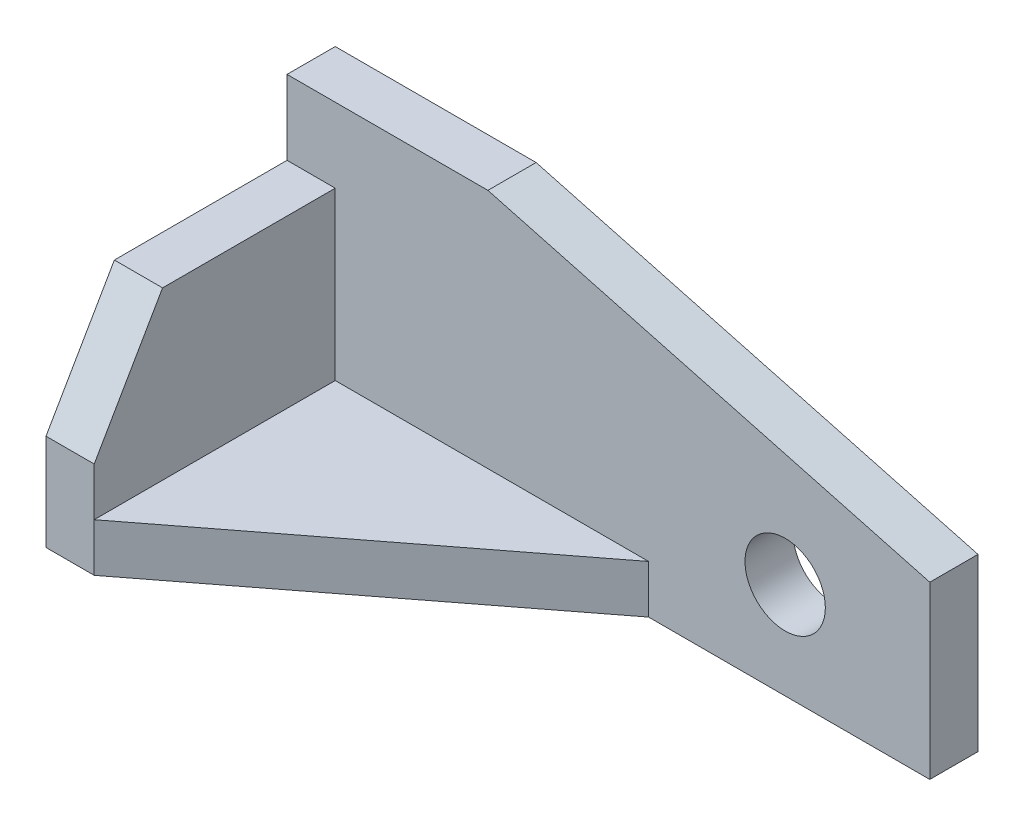
ISO-10303-21;
HEADER;
FILE_DESCRIPTION(('STEP AP214'),'2;1');
FILE_NAME('part.step','',(''),(''),'','','');
FILE_SCHEMA(('AUTOMOTIVE_DESIGN { 1 0 10303 214 1 1 1 1 }'));
ENDSEC;
DATA;
#1=APPLICATION_CONTEXT('core data for automotive mechanical design processes');
#2=APPLICATION_PROTOCOL_DEFINITION('international standard','automotive_design',2000,#1);
#3=PRODUCT_CONTEXT('',#1,'mechanical');
#4=PRODUCT('Part','Part','',(#3));
#5=PRODUCT_RELATED_PRODUCT_CATEGORY('part','',(#4));
#6=PRODUCT_DEFINITION_FORMATION('','',#4);
#7=PRODUCT_DEFINITION_CONTEXT('part definition',#1,'design');
#8=PRODUCT_DEFINITION('design','',#6,#7);
#9=PRODUCT_DEFINITION_SHAPE('','',#8);
#10=(LENGTH_UNIT() NAMED_UNIT(*) SI_UNIT(.MILLI.,.METRE.));
#11=(NAMED_UNIT(*) PLANE_ANGLE_UNIT() SI_UNIT($,.RADIAN.));
#12=(NAMED_UNIT(*) SI_UNIT($,.STERADIAN.) SOLID_ANGLE_UNIT());
#13=UNCERTAINTY_MEASURE_WITH_UNIT(LENGTH_MEASURE(1.E-05),#10,'distance_accuracy_value','');
#14=(GEOMETRIC_REPRESENTATION_CONTEXT(3) GLOBAL_UNCERTAINTY_ASSIGNED_CONTEXT((#13)) GLOBAL_UNIT_ASSIGNED_CONTEXT((#10,
#11,#12)) REPRESENTATION_CONTEXT('',''));
#15=CARTESIAN_POINT('',(0.,0.,0.));
#16=DIRECTION('',(0.,0.,1.));
#17=DIRECTION('',(1.,0.,0.));
#18=AXIS2_PLACEMENT_3D('',#15,#16,#17);
#19=CARTESIAN_POINT('',(0.,0.,0.));
#20=DIRECTION('',(0.,0.,1.));
#21=DIRECTION('',(1.,0.,0.));
#22=AXIS2_PLACEMENT_3D('',#19,#20,#21);
#23=PLANE('',#22);
#24=CARTESIAN_POINT('',(62.,12.,0.));
#25=DIRECTION('',(0.,0.,1.));
#26=DIRECTION('',(1.,0.,0.));
#27=AXIS2_PLACEMENT_3D('',#24,#25,#26);
#28=CIRCLE('',#27,5.);
#29=CARTESIAN_POINT('',(67.,12.,0.));
#30=VERTEX_POINT('',#29);
#31=EDGE_CURVE('E127',#30,#30,#28,.T.);
#32=ORIENTED_EDGE('',*,*,#31,.F.);
#33=EDGE_LOOP('',(#32));
#34=FACE_BOUND('',#33,.T.);
#35=DIRECTION('',(-1.,0.,0.));
#36=VECTOR('',#35,1.);
#37=CARTESIAN_POINT('',(0.,6.,0.));
#38=LINE('',#37,#36);
#39=CARTESIAN_POINT('',(45.,6.,0.));
#40=VERTEX_POINT('',#39);
#41=CARTESIAN_POINT('',(6.,6.,0.));
#42=VERTEX_POINT('',#41);
#43=EDGE_CURVE('E48',#40,#42,#38,.T.);
#44=ORIENTED_EDGE('',*,*,#43,.F.);
#45=DIRECTION('',(0.,-1.,0.));
#46=VECTOR('',#45,1.);
#47=CARTESIAN_POINT('',(45.,6.,0.));
#48=LINE('',#47,#46);
#49=CARTESIAN_POINT('',(45.,0.,0.));
#50=VERTEX_POINT('',#49);
#51=EDGE_CURVE('E53',#40,#50,#48,.T.);
#52=ORIENTED_EDGE('',*,*,#51,.T.);
#53=DIRECTION('',(1.,0.,0.));
#54=VECTOR('',#53,1.);
#55=CARTESIAN_POINT('',(0.,0.,0.));
#56=LINE('',#55,#54);
#57=CARTESIAN_POINT('',(80.,0.,0.));
#58=VERTEX_POINT('',#57);
#59=EDGE_CURVE('E35',#50,#58,#56,.T.);
#60=ORIENTED_EDGE('',*,*,#59,.T.);
#61=DIRECTION('',(0.,1.,0.));
#62=VECTOR('',#61,1.);
#63=CARTESIAN_POINT('',(80.,0.,0.));
#64=LINE('',#63,#62);
#65=CARTESIAN_POINT('',(80.,21.2627944162882,0.));
#66=VERTEX_POINT('',#65);
#67=EDGE_CURVE('E186',#58,#66,#64,.T.);
#68=ORIENTED_EDGE('',*,*,#67,.T.);
#69=DIRECTION('',(-0.965925826289068,0.258819045102521,0.));
#70=VECTOR('',#69,1.);
#71=CARTESIAN_POINT('',(80.,21.2627944162882,0.));
#72=LINE('',#71,#70);
#73=CARTESIAN_POINT('',(25.,36.,0.));
#74=VERTEX_POINT('',#73);
#75=EDGE_CURVE('E187',#66,#74,#72,.T.);
#76=ORIENTED_EDGE('',*,*,#75,.T.);
#77=DIRECTION('',(-1.,0.,0.));
#78=VECTOR('',#77,1.);
#79=CARTESIAN_POINT('',(25.,36.,0.));
#80=LINE('',#79,#78);
#81=CARTESIAN_POINT('',(0.,36.,0.));
#82=VERTEX_POINT('',#81);
#83=EDGE_CURVE('E200',#74,#82,#80,.T.);
#84=ORIENTED_EDGE('',*,*,#83,.T.);
#85=DIRECTION('',(0.,-1.,0.));
#86=VECTOR('',#85,1.);
#87=CARTESIAN_POINT('',(0.,36.,0.));
#88=LINE('',#87,#86);
#89=CARTESIAN_POINT('',(0.,26.7348499904871,0.));
#90=VERTEX_POINT('',#89);
#91=EDGE_CURVE('E124',#82,#90,#88,.T.);
#92=ORIENTED_EDGE('',*,*,#91,.T.);
#93=DIRECTION('',(-1.,0.,0.));
#94=VECTOR('',#93,1.);
#95=CARTESIAN_POINT('',(6.,26.7348499904871,0.));
#96=LINE('',#95,#94);
#97=CARTESIAN_POINT('',(6.,26.7348499904871,0.));
#98=VERTEX_POINT('',#97);
#99=EDGE_CURVE('E121',#98,#90,#96,.T.);
#100=ORIENTED_EDGE('',*,*,#99,.F.);
#101=DIRECTION('',(0.,1.,0.));
#102=VECTOR('',#101,1.);
#103=CARTESIAN_POINT('',(6.,26.7348499904871,0.));
#104=LINE('',#103,#102);
#105=EDGE_CURVE('E111',#42,#98,#104,.T.);
#106=ORIENTED_EDGE('',*,*,#105,.F.);
#107=EDGE_LOOP('',(#44,#52,#60,#68,#76,#84,#92,#100,#106));
#108=FACE_BOUND('',#107,.T.);
#109=ADVANCED_FACE('F31',(#34,#108),#23,.T.);
#110=CARTESIAN_POINT('',(6.,0.,0.));
#111=DIRECTION('',(-1.,0.,0.));
#112=DIRECTION('',(0.,0.,1.));
#113=AXIS2_PLACEMENT_3D('',#110,#111,#112);
#114=PLANE('',#113);
#115=DIRECTION('',(0.,0.,1.));
#116=VECTOR('',#115,1.);
#117=CARTESIAN_POINT('',(6.,6.,0.));
#118=LINE('',#117,#116);
#119=CARTESIAN_POINT('',(6.,6.,30.));
#120=VERTEX_POINT('',#119);
#121=EDGE_CURVE('E11',#42,#120,#118,.T.);
#122=ORIENTED_EDGE('',*,*,#121,.F.);
#123=ORIENTED_EDGE('',*,*,#105,.T.);
#124=DIRECTION('',(0.,0.,1.));
#125=VECTOR('',#124,1.);
#126=CARTESIAN_POINT('',(6.,26.7348499904871,21.4928303915235));
#127=LINE('',#126,#125);
#128=CARTESIAN_POINT('',(6.,26.7348499904871,21.4928303915235));
#129=VERTEX_POINT('',#128);
#130=EDGE_CURVE('E115',#98,#129,#127,.T.);
#131=ORIENTED_EDGE('',*,*,#130,.T.);
#132=DIRECTION('',(0.,-0.866025403784438,0.500000000000001));
#133=VECTOR('',#132,1.);
#134=CARTESIAN_POINT('',(6.,12.,30.));
#135=LINE('',#134,#133);
#136=CARTESIAN_POINT('',(6.,12.,30.));
#137=VERTEX_POINT('',#136);
#138=EDGE_CURVE('E133',#129,#137,#135,.T.);
#139=ORIENTED_EDGE('',*,*,#138,.T.);
#140=DIRECTION('',(0.,-1.,0.));
#141=VECTOR('',#140,1.);
#142=CARTESIAN_POINT('',(6.,0.,30.));
#143=LINE('',#142,#141);
#144=EDGE_CURVE('E135',#137,#120,#143,.T.);
#145=ORIENTED_EDGE('',*,*,#144,.T.);
#146=EDGE_LOOP('',(#122,#123,#131,#139,#145));
#147=FACE_BOUND('',#146,.T.);
#148=ADVANCED_FACE('F113',(#147),#114,.F.);
#149=CARTESIAN_POINT('',(0.,36.,-6.));
#150=DIRECTION('',(-1.,0.,0.));
#151=DIRECTION('',(0.,-1.,0.));
#152=AXIS2_PLACEMENT_3D('',#149,#150,#151);
#153=PLANE('',#152);
#154=DIRECTION('',(0.,0.,1.));
#155=VECTOR('',#154,1.);
#156=CARTESIAN_POINT('',(0.,0.,-6.));
#157=LINE('',#156,#155);
#158=CARTESIAN_POINT('',(0.,0.,-6.));
#159=VERTEX_POINT('',#158);
#160=CARTESIAN_POINT('',(0.,0.,30.));
#161=VERTEX_POINT('',#160);
#162=EDGE_CURVE('E210',#159,#161,#157,.T.);
#163=ORIENTED_EDGE('',*,*,#162,.T.);
#164=DIRECTION('',(0.,-1.,0.));
#165=VECTOR('',#164,1.);
#166=CARTESIAN_POINT('',(0.,0.,30.));
#167=LINE('',#166,#165);
#168=CARTESIAN_POINT('',(0.,12.,30.));
#169=VERTEX_POINT('',#168);
#170=EDGE_CURVE('E118',#169,#161,#167,.T.);
#171=ORIENTED_EDGE('',*,*,#170,.F.);
#172=DIRECTION('',(0.,-0.866025403784438,0.500000000000001));
#173=VECTOR('',#172,1.);
#174=CARTESIAN_POINT('',(0.,12.,30.));
#175=LINE('',#174,#173);
#176=CARTESIAN_POINT('',(0.,26.7348499904871,21.4928303915235));
#177=VERTEX_POINT('',#176);
#178=EDGE_CURVE('E143',#177,#169,#175,.T.);
#179=ORIENTED_EDGE('',*,*,#178,.F.);
#180=DIRECTION('',(0.,0.,1.));
#181=VECTOR('',#180,1.);
#182=CARTESIAN_POINT('',(0.,26.7348499904871,21.4928303915235));
#183=LINE('',#182,#181);
#184=EDGE_CURVE('E145',#90,#177,#183,.T.);
#185=ORIENTED_EDGE('',*,*,#184,.F.);
#186=ORIENTED_EDGE('',*,*,#91,.F.);
#187=DIRECTION('',(0.,0.,1.));
#188=VECTOR('',#187,1.);
#189=CARTESIAN_POINT('',(0.,36.,-6.));
#190=LINE('',#189,#188);
#191=CARTESIAN_POINT('',(0.,36.,-6.));
#192=VERTEX_POINT('',#191);
#193=EDGE_CURVE('E41',#192,#82,#190,.T.);
#194=ORIENTED_EDGE('',*,*,#193,.F.);
#195=DIRECTION('',(0.,-1.,0.));
#196=VECTOR('',#195,1.);
#197=CARTESIAN_POINT('',(0.,36.,-6.));
#198=LINE('',#197,#196);
#199=EDGE_CURVE('E196',#192,#159,#198,.T.);
#200=ORIENTED_EDGE('',*,*,#199,.T.);
#201=EDGE_LOOP('',(#163,#171,#179,#185,#186,#194,#200));
#202=FACE_BOUND('',#201,.T.);
#203=ADVANCED_FACE('F33',(#202),#153,.T.);
#204=CARTESIAN_POINT('',(25.,36.,-6.));
#205=DIRECTION('',(0.,1.,0.));
#206=DIRECTION('',(0.,0.,1.));
#207=AXIS2_PLACEMENT_3D('',#204,#205,#206);
#208=PLANE('',#207);
#209=ORIENTED_EDGE('',*,*,#83,.F.);
#210=DIRECTION('',(0.,0.,1.));
#211=VECTOR('',#210,1.);
#212=CARTESIAN_POINT('',(25.,36.,-6.));
#213=LINE('',#212,#211);
#214=CARTESIAN_POINT('',(25.,36.,-6.));
#215=VERTEX_POINT('',#214);
#216=EDGE_CURVE('E218',#215,#74,#213,.T.);
#217=ORIENTED_EDGE('',*,*,#216,.F.);
#218=DIRECTION('',(-1.,0.,0.));
#219=VECTOR('',#218,1.);
#220=CARTESIAN_POINT('',(25.,36.,-6.));
#221=LINE('',#220,#219);
#222=EDGE_CURVE('E208',#215,#192,#221,.T.);
#223=ORIENTED_EDGE('',*,*,#222,.T.);
#224=ORIENTED_EDGE('',*,*,#193,.T.);
#225=EDGE_LOOP('',(#209,#217,#223,#224));
#226=FACE_BOUND('',#225,.T.);
#227=ADVANCED_FACE('F236',(#226),#208,.T.);
#228=CARTESIAN_POINT('',(80.,21.2627944162882,-6.));
#229=DIRECTION('',(0.258819045102521,0.965925826289068,0.));
#230=DIRECTION('',(-0.965925826289068,0.258819045102521,0.));
#231=AXIS2_PLACEMENT_3D('',#228,#229,#230);
#232=PLANE('',#231);
#233=ORIENTED_EDGE('',*,*,#75,.F.);
#234=DIRECTION('',(0.,0.,1.));
#235=VECTOR('',#234,1.);
#236=CARTESIAN_POINT('',(80.,21.2627944162882,-6.));
#237=LINE('',#236,#235);
#238=CARTESIAN_POINT('',(80.,21.2627944162882,-6.));
#239=VERTEX_POINT('',#238);
#240=EDGE_CURVE('E220',#239,#66,#237,.T.);
#241=ORIENTED_EDGE('',*,*,#240,.F.);
#242=DIRECTION('',(-0.965925826289068,0.258819045102521,0.));
#243=VECTOR('',#242,1.);
#244=CARTESIAN_POINT('',(80.,21.2627944162882,-6.));
#245=LINE('',#244,#243);
#246=EDGE_CURVE('E205',#239,#215,#245,.T.);
#247=ORIENTED_EDGE('',*,*,#246,.T.);
#248=ORIENTED_EDGE('',*,*,#216,.T.);
#249=EDGE_LOOP('',(#233,#241,#247,#248));
#250=FACE_BOUND('',#249,.T.);
#251=ADVANCED_FACE('F245',(#250),#232,.T.);
#252=CARTESIAN_POINT('',(80.,0.,-6.));
#253=DIRECTION('',(1.,0.,0.));
#254=DIRECTION('',(0.,0.,-1.));
#255=AXIS2_PLACEMENT_3D('',#252,#253,#254);
#256=PLANE('',#255);
#257=ORIENTED_EDGE('',*,*,#67,.F.);
#258=DIRECTION('',(0.,0.,1.));
#259=VECTOR('',#258,1.);
#260=CARTESIAN_POINT('',(80.,0.,-6.));
#261=LINE('',#260,#259);
#262=CARTESIAN_POINT('',(80.,0.,-6.));
#263=VERTEX_POINT('',#262);
#264=EDGE_CURVE('E183',#263,#58,#261,.T.);
#265=ORIENTED_EDGE('',*,*,#264,.F.);
#266=DIRECTION('',(0.,1.,0.));
#267=VECTOR('',#266,1.);
#268=CARTESIAN_POINT('',(80.,0.,-6.));
#269=LINE('',#268,#267);
#270=EDGE_CURVE('E202',#263,#239,#269,.T.);
#271=ORIENTED_EDGE('',*,*,#270,.T.);
#272=ORIENTED_EDGE('',*,*,#240,.T.);
#273=EDGE_LOOP('',(#257,#265,#271,#272));
#274=FACE_BOUND('',#273,.T.);
#275=ADVANCED_FACE('F243',(#274),#256,.T.);
#276=CARTESIAN_POINT('',(0.,0.,-6.));
#277=DIRECTION('',(0.,-1.,0.));
#278=DIRECTION('',(0.,0.,-1.));
#279=AXIS2_PLACEMENT_3D('',#276,#277,#278);
#280=PLANE('',#279);
#281=DIRECTION('',(-1.,0.,0.));
#282=VECTOR('',#281,1.);
#283=CARTESIAN_POINT('',(6.,0.,30.));
#284=LINE('',#283,#282);
#285=CARTESIAN_POINT('',(6.,0.,30.));
#286=VERTEX_POINT('',#285);
#287=EDGE_CURVE('E142',#286,#161,#284,.T.);
#288=ORIENTED_EDGE('',*,*,#287,.T.);
#289=ORIENTED_EDGE('',*,*,#162,.F.);
#290=DIRECTION('',(1.,0.,0.));
#291=VECTOR('',#290,1.);
#292=CARTESIAN_POINT('',(0.,0.,-6.));
#293=LINE('',#292,#291);
#294=EDGE_CURVE('E199',#159,#263,#293,.T.);
#295=ORIENTED_EDGE('',*,*,#294,.T.);
#296=ORIENTED_EDGE('',*,*,#264,.T.);
#297=ORIENTED_EDGE('',*,*,#59,.F.);
#298=DIRECTION('',(0.7926239891046,0.,-0.609710760849692));
#299=VECTOR('',#298,1.);
#300=CARTESIAN_POINT('',(45.,0.,0.));
#301=LINE('',#300,#299);
#302=EDGE_CURVE('E174',#286,#50,#301,.T.);
#303=ORIENTED_EDGE('',*,*,#302,.F.);
#304=EDGE_LOOP('',(#288,#289,#295,#296,#297,#303));
#305=FACE_BOUND('',#304,.T.);
#306=ADVANCED_FACE('F180',(#305),#280,.T.);
#307=CARTESIAN_POINT('',(0.,0.,-6.));
#308=DIRECTION('',(0.,0.,1.));
#309=DIRECTION('',(1.,0.,0.));
#310=AXIS2_PLACEMENT_3D('',#307,#308,#309);
#311=PLANE('',#310);
#312=CARTESIAN_POINT('',(62.,12.,-6.));
#313=DIRECTION('',(0.,0.,1.));
#314=DIRECTION('',(1.,0.,0.));
#315=AXIS2_PLACEMENT_3D('',#312,#313,#314);
#316=CIRCLE('',#315,5.);
#317=CARTESIAN_POINT('',(67.,12.,-6.));
#318=VERTEX_POINT('',#317);
#319=EDGE_CURVE('E156',#318,#318,#316,.T.);
#320=ORIENTED_EDGE('',*,*,#319,.T.);
#321=EDGE_LOOP('',(#320));
#322=FACE_BOUND('',#321,.T.);
#323=ORIENTED_EDGE('',*,*,#199,.F.);
#324=ORIENTED_EDGE('',*,*,#222,.F.);
#325=ORIENTED_EDGE('',*,*,#246,.F.);
#326=ORIENTED_EDGE('',*,*,#270,.F.);
#327=ORIENTED_EDGE('',*,*,#294,.F.);
#328=EDGE_LOOP('',(#323,#324,#325,#326,#327));
#329=FACE_BOUND('',#328,.T.);
#330=ADVANCED_FACE('F240',(#322,#329),#311,.F.);
#331=CARTESIAN_POINT('',(62.,12.,-6.));
#332=DIRECTION('',(0.,0.,1.));
#333=DIRECTION('',(1.,0.,0.));
#334=AXIS2_PLACEMENT_3D('',#331,#332,#333);
#335=CYLINDRICAL_SURFACE('',#334,5.);
#336=ORIENTED_EDGE('',*,*,#319,.F.);
#337=EDGE_LOOP('',(#336));
#338=FACE_BOUND('',#337,.T.);
#339=ORIENTED_EDGE('',*,*,#31,.T.);
#340=EDGE_LOOP('',(#339));
#341=FACE_BOUND('',#340,.T.);
#342=ADVANCED_FACE('F264',(#338,#341),#335,.F.);
#343=CARTESIAN_POINT('',(6.,26.7348499904871,21.4928303915235));
#344=DIRECTION('',(0.,-1.,0.));
#345=DIRECTION('',(0.,0.,-1.));
#346=AXIS2_PLACEMENT_3D('',#343,#344,#345);
#347=PLANE('',#346);
#348=ORIENTED_EDGE('',*,*,#184,.T.);
#349=DIRECTION('',(-1.,0.,0.));
#350=VECTOR('',#349,1.);
#351=CARTESIAN_POINT('',(6.,26.7348499904871,21.4928303915235));
#352=LINE('',#351,#350);
#353=EDGE_CURVE('E128',#129,#177,#352,.T.);
#354=ORIENTED_EDGE('',*,*,#353,.F.);
#355=ORIENTED_EDGE('',*,*,#130,.F.);
#356=ORIENTED_EDGE('',*,*,#99,.T.);
#357=EDGE_LOOP('',(#348,#354,#355,#356));
#358=FACE_BOUND('',#357,.T.);
#359=ADVANCED_FACE('F130',(#358),#347,.F.);
#360=CARTESIAN_POINT('',(6.,12.,30.));
#361=DIRECTION('',(0.,-0.500000000000001,-0.866025403784438));
#362=DIRECTION('',(0.,0.866025403784438,-0.500000000000001));
#363=AXIS2_PLACEMENT_3D('',#360,#361,#362);
#364=PLANE('',#363);
#365=ORIENTED_EDGE('',*,*,#178,.T.);
#366=DIRECTION('',(-1.,0.,0.));
#367=VECTOR('',#366,1.);
#368=CARTESIAN_POINT('',(6.,12.,30.));
#369=LINE('',#368,#367);
#370=EDGE_CURVE('E150',#137,#169,#369,.T.);
#371=ORIENTED_EDGE('',*,*,#370,.F.);
#372=ORIENTED_EDGE('',*,*,#138,.F.);
#373=ORIENTED_EDGE('',*,*,#353,.T.);
#374=EDGE_LOOP('',(#365,#371,#372,#373));
#375=FACE_BOUND('',#374,.T.);
#376=ADVANCED_FACE('F232',(#375),#364,.F.);
#377=CARTESIAN_POINT('',(6.,0.,30.));
#378=DIRECTION('',(0.,0.,-1.));
#379=DIRECTION('',(-1.,0.,0.));
#380=AXIS2_PLACEMENT_3D('',#377,#378,#379);
#381=PLANE('',#380);
#382=DIRECTION('',(0.,-1.,0.));
#383=VECTOR('',#382,1.);
#384=CARTESIAN_POINT('',(6.,6.,30.));
#385=LINE('',#384,#383);
#386=EDGE_CURVE('E138',#120,#286,#385,.T.);
#387=ORIENTED_EDGE('',*,*,#386,.F.);
#388=ORIENTED_EDGE('',*,*,#144,.F.);
#389=ORIENTED_EDGE('',*,*,#370,.T.);
#390=ORIENTED_EDGE('',*,*,#170,.T.);
#391=ORIENTED_EDGE('',*,*,#287,.F.);
#392=EDGE_LOOP('',(#387,#388,#389,#390,#391));
#393=FACE_BOUND('',#392,.T.);
#394=ADVANCED_FACE('F228',(#393),#381,.F.);
#395=CARTESIAN_POINT('',(0.,6.,0.));
#396=DIRECTION('',(0.,-1.,0.));
#397=DIRECTION('',(0.,0.,-1.));
#398=AXIS2_PLACEMENT_3D('',#395,#396,#397);
#399=PLANE('',#398);
#400=ORIENTED_EDGE('',*,*,#43,.T.);
#401=ORIENTED_EDGE('',*,*,#121,.T.);
#402=DIRECTION('',(0.7926239891046,0.,-0.609710760849692));
#403=VECTOR('',#402,1.);
#404=CARTESIAN_POINT('',(45.,6.,0.));
#405=LINE('',#404,#403);
#406=EDGE_CURVE('E171',#120,#40,#405,.T.);
#407=ORIENTED_EDGE('',*,*,#406,.T.);
#408=EDGE_LOOP('',(#400,#401,#407));
#409=FACE_BOUND('',#408,.T.);
#410=ADVANCED_FACE('F177',(#409),#399,.F.);
#411=CARTESIAN_POINT('',(45.,6.,0.));
#412=DIRECTION('',(-0.609710760849692,0.,-0.7926239891046));
#413=DIRECTION('',(-0.7926239891046,0.,0.609710760849692));
#414=AXIS2_PLACEMENT_3D('',#411,#412,#413);
#415=PLANE('',#414);
#416=ORIENTED_EDGE('',*,*,#302,.T.);
#417=ORIENTED_EDGE('',*,*,#51,.F.);
#418=ORIENTED_EDGE('',*,*,#406,.F.);
#419=ORIENTED_EDGE('',*,*,#386,.T.);
#420=EDGE_LOOP('',(#416,#417,#418,#419));
#421=FACE_BOUND('',#420,.T.);
#422=ADVANCED_FACE('F178',(#421),#415,.F.);
#423=CLOSED_SHELL('',(#109,#148,#203,#227,#251,#275,#306,#330,#342,#359,#376,#394,#410,#422));
#424=MANIFOLD_SOLID_BREP('B2',#423);
#425=ADVANCED_BREP_SHAPE_REPRESENTATION('',(#18,#424),#14);
#426=SHAPE_DEFINITION_REPRESENTATION(#9,#425);
ENDSEC;
END-ISO-10303-21;
